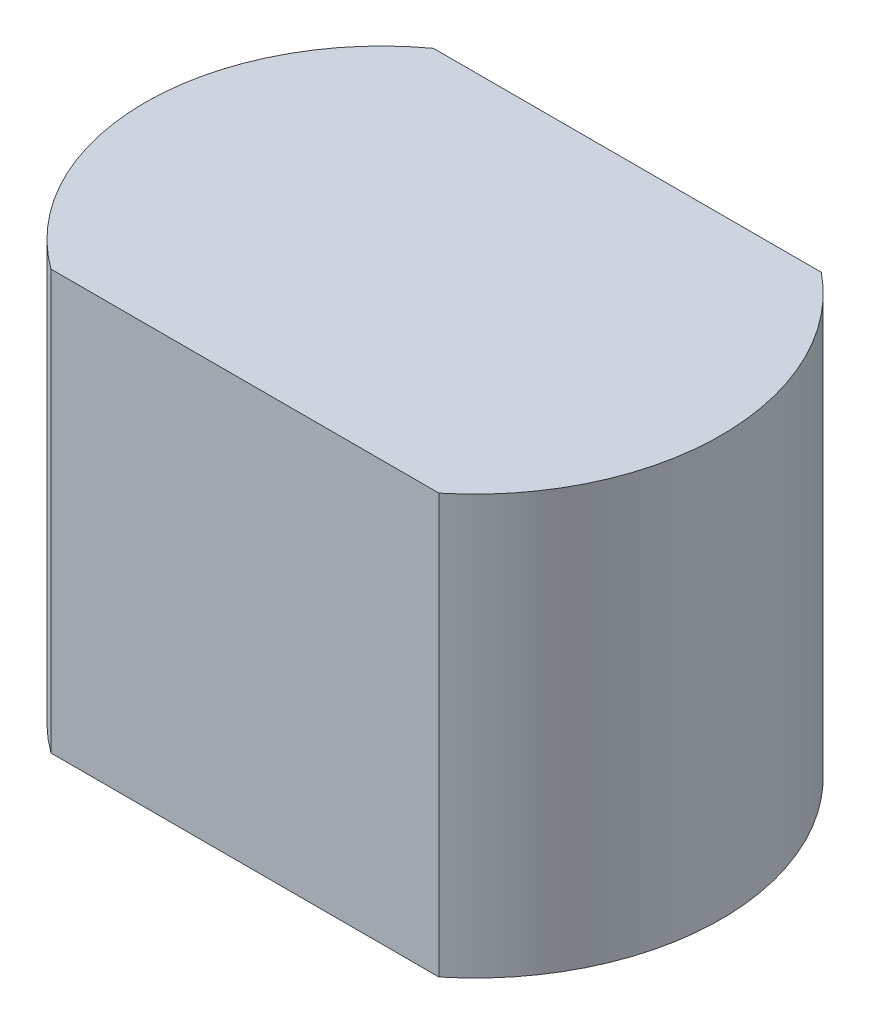
ISO-10303-21;
HEADER;
FILE_DESCRIPTION(('STEP AP214'),'2;1');
FILE_NAME('part.step','',(''),(''),'','','');
FILE_SCHEMA(('AUTOMOTIVE_DESIGN { 1 0 10303 214 1 1 1 1 }'));
ENDSEC;
DATA;
#1=APPLICATION_CONTEXT('core data for automotive mechanical design processes');
#2=APPLICATION_PROTOCOL_DEFINITION('international standard','automotive_design',2000,#1);
#3=PRODUCT_CONTEXT('',#1,'mechanical');
#4=PRODUCT('Part','Part','',(#3));
#5=PRODUCT_RELATED_PRODUCT_CATEGORY('part','',(#4));
#6=PRODUCT_DEFINITION_FORMATION('','',#4);
#7=PRODUCT_DEFINITION_CONTEXT('part definition',#1,'design');
#8=PRODUCT_DEFINITION('design','',#6,#7);
#9=PRODUCT_DEFINITION_SHAPE('','',#8);
#10=(LENGTH_UNIT() NAMED_UNIT(*) SI_UNIT(.MILLI.,.METRE.));
#11=(NAMED_UNIT(*) PLANE_ANGLE_UNIT() SI_UNIT($,.RADIAN.));
#12=(NAMED_UNIT(*) SI_UNIT($,.STERADIAN.) SOLID_ANGLE_UNIT());
#13=UNCERTAINTY_MEASURE_WITH_UNIT(LENGTH_MEASURE(1.E-05),#10,'distance_accuracy_value','');
#14=(GEOMETRIC_REPRESENTATION_CONTEXT(3) GLOBAL_UNCERTAINTY_ASSIGNED_CONTEXT((#13)) GLOBAL_UNIT_ASSIGNED_CONTEXT((#10,
#11,#12)) REPRESENTATION_CONTEXT('',''));
#15=CARTESIAN_POINT('',(0.,0.,0.));
#16=DIRECTION('',(0.,0.,1.));
#17=DIRECTION('',(1.,0.,0.));
#18=AXIS2_PLACEMENT_3D('',#15,#16,#17);
#19=CARTESIAN_POINT('',(-2.84057589804899,4.,-0.678750097591803));
#20=DIRECTION('',(0.,-1.,0.));
#21=DIRECTION('',(0.,0.,-1.));
#22=AXIS2_PLACEMENT_3D('',#19,#20,#21);
#23=CYLINDRICAL_SURFACE('',#22,2.25839401033057);
#24=CARTESIAN_POINT('',(-2.84057589804899,0.,-0.678750097591803));
#25=DIRECTION('',(0.,1.,0.));
#26=DIRECTION('',(0.,0.,1.));
#27=AXIS2_PLACEMENT_3D('',#24,#25,#26);
#28=CIRCLE('',#27,2.25839401033057);
#29=CARTESIAN_POINT('',(-4.17088357144525,0.,-2.5037500975918));
#30=VERTEX_POINT('',#29);
#31=CARTESIAN_POINT('',(-4.17088357144525,0.,1.1462499024082));
#32=VERTEX_POINT('',#31);
#33=EDGE_CURVE('E102',#30,#32,#28,.T.);
#34=ORIENTED_EDGE('',*,*,#33,.T.);
#35=DIRECTION('',(0.,-1.,0.));
#36=VECTOR('',#35,1.);
#37=CARTESIAN_POINT('',(-4.17088357144525,4.,1.1462499024082));
#38=LINE('',#37,#36);
#39=CARTESIAN_POINT('',(-4.17088357144525,4.,1.1462499024082));
#40=VERTEX_POINT('',#39);
#41=EDGE_CURVE('E11',#40,#32,#38,.T.);
#42=ORIENTED_EDGE('',*,*,#41,.F.);
#43=CARTESIAN_POINT('',(-2.84057589804899,4.,-0.678750097591803));
#44=DIRECTION('',(0.,1.,0.));
#45=DIRECTION('',(0.,0.,1.));
#46=AXIS2_PLACEMENT_3D('',#43,#44,#45);
#47=CIRCLE('',#46,2.25839401033057);
#48=CARTESIAN_POINT('',(-4.17088357144525,4.,-2.5037500975918));
#49=VERTEX_POINT('',#48);
#50=EDGE_CURVE('E90',#49,#40,#47,.T.);
#51=ORIENTED_EDGE('',*,*,#50,.F.);
#52=DIRECTION('',(0.,-1.,0.));
#53=VECTOR('',#52,1.);
#54=CARTESIAN_POINT('',(-4.17088357144525,4.,-2.5037500975918));
#55=LINE('',#54,#53);
#56=EDGE_CURVE('E98',#49,#30,#55,.T.);
#57=ORIENTED_EDGE('',*,*,#56,.T.);
#58=EDGE_LOOP('',(#34,#42,#51,#57));
#59=FACE_BOUND('',#58,.T.);
#60=ADVANCED_FACE('F39',(#59),#23,.T.);
#61=CARTESIAN_POINT('',(-0.468391856893293,4.,1.1462499024082));
#62=DIRECTION('',(0.,0.,-1.));
#63=DIRECTION('',(-1.,0.,0.));
#64=AXIS2_PLACEMENT_3D('',#61,#62,#63);
#65=PLANE('',#64);
#66=DIRECTION('',(1.,0.,0.));
#67=VECTOR('',#66,1.);
#68=CARTESIAN_POINT('',(-0.468391856893293,0.,1.1462499024082));
#69=LINE('',#68,#67);
#70=CARTESIAN_POINT('',(-0.468391856893293,0.,1.1462499024082));
#71=VERTEX_POINT('',#70);
#72=EDGE_CURVE('E94',#32,#71,#69,.T.);
#73=ORIENTED_EDGE('',*,*,#72,.T.);
#74=DIRECTION('',(0.,-1.,0.));
#75=VECTOR('',#74,1.);
#76=CARTESIAN_POINT('',(-0.468391856893293,4.,1.1462499024082));
#77=LINE('',#76,#75);
#78=CARTESIAN_POINT('',(-0.468391856893293,4.,1.1462499024082));
#79=VERTEX_POINT('',#78);
#80=EDGE_CURVE('E47',#79,#71,#77,.T.);
#81=ORIENTED_EDGE('',*,*,#80,.F.);
#82=DIRECTION('',(1.,0.,0.));
#83=VECTOR('',#82,1.);
#84=CARTESIAN_POINT('',(-0.468391856893293,4.,1.1462499024082));
#85=LINE('',#84,#83);
#86=EDGE_CURVE('E85',#40,#79,#85,.T.);
#87=ORIENTED_EDGE('',*,*,#86,.F.);
#88=ORIENTED_EDGE('',*,*,#41,.T.);
#89=EDGE_LOOP('',(#73,#81,#87,#88));
#90=FACE_BOUND('',#89,.T.);
#91=ADVANCED_FACE('F93',(#90),#65,.F.);
#92=CARTESIAN_POINT('',(-1.94910584153794,4.,-0.678750097591803));
#93=DIRECTION('',(0.,-1.,0.));
#94=DIRECTION('',(0.,0.,-1.));
#95=AXIS2_PLACEMENT_3D('',#92,#93,#94);
#96=CYLINDRICAL_SURFACE('',#95,2.35013593315838);
#97=CARTESIAN_POINT('',(-1.94910584153794,0.,-0.678750097591803));
#98=DIRECTION('',(0.,1.,0.));
#99=DIRECTION('',(0.,0.,-1.));
#100=AXIS2_PLACEMENT_3D('',#97,#98,#99);
#101=CIRCLE('',#100,2.35013593315838);
#102=CARTESIAN_POINT('',(-0.468391856893294,0.,-2.5037500975918));
#103=VERTEX_POINT('',#102);
#104=EDGE_CURVE('E72',#71,#103,#101,.T.);
#105=ORIENTED_EDGE('',*,*,#104,.T.);
#106=DIRECTION('',(0.,-1.,0.));
#107=VECTOR('',#106,1.);
#108=CARTESIAN_POINT('',(-0.468391856893294,4.,-2.5037500975918));
#109=LINE('',#108,#107);
#110=CARTESIAN_POINT('',(-0.468391856893294,4.,-2.5037500975918));
#111=VERTEX_POINT('',#110);
#112=EDGE_CURVE('E95',#111,#103,#109,.T.);
#113=ORIENTED_EDGE('',*,*,#112,.F.);
#114=CARTESIAN_POINT('',(-1.94910584153794,4.,-0.678750097591803));
#115=DIRECTION('',(0.,1.,0.));
#116=DIRECTION('',(0.,0.,-1.));
#117=AXIS2_PLACEMENT_3D('',#114,#115,#116);
#118=CIRCLE('',#117,2.35013593315838);
#119=EDGE_CURVE('E88',#79,#111,#118,.T.);
#120=ORIENTED_EDGE('',*,*,#119,.F.);
#121=ORIENTED_EDGE('',*,*,#80,.T.);
#122=EDGE_LOOP('',(#105,#113,#120,#121));
#123=FACE_BOUND('',#122,.T.);
#124=ADVANCED_FACE('F96',(#123),#96,.T.);
#125=CARTESIAN_POINT('',(-4.17088357144525,4.,-2.5037500975918));
#126=DIRECTION('',(0.,0.,1.));
#127=DIRECTION('',(1.,0.,0.));
#128=AXIS2_PLACEMENT_3D('',#125,#126,#127);
#129=PLANE('',#128);
#130=DIRECTION('',(-1.,0.,0.));
#131=VECTOR('',#130,1.);
#132=CARTESIAN_POINT('',(-4.17088357144525,0.,-2.5037500975918));
#133=LINE('',#132,#131);
#134=EDGE_CURVE('E78',#103,#30,#133,.T.);
#135=ORIENTED_EDGE('',*,*,#134,.T.);
#136=ORIENTED_EDGE('',*,*,#56,.F.);
#137=DIRECTION('',(-1.,0.,0.));
#138=VECTOR('',#137,1.);
#139=CARTESIAN_POINT('',(-4.17088357144525,4.,-2.5037500975918));
#140=LINE('',#139,#138);
#141=EDGE_CURVE('E55',#111,#49,#140,.T.);
#142=ORIENTED_EDGE('',*,*,#141,.F.);
#143=ORIENTED_EDGE('',*,*,#112,.T.);
#144=EDGE_LOOP('',(#135,#136,#142,#143));
#145=FACE_BOUND('',#144,.T.);
#146=ADVANCED_FACE('F109',(#145),#129,.F.);
#147=CARTESIAN_POINT('',(-2.84057589804899,4.,-0.678750097591803));
#148=DIRECTION('',(0.,1.,0.));
#149=DIRECTION('',(0.,0.,1.));
#150=AXIS2_PLACEMENT_3D('',#147,#148,#149);
#151=PLANE('',#150);
#152=ORIENTED_EDGE('',*,*,#50,.T.);
#153=ORIENTED_EDGE('',*,*,#86,.T.);
#154=ORIENTED_EDGE('',*,*,#119,.T.);
#155=ORIENTED_EDGE('',*,*,#141,.T.);
#156=EDGE_LOOP('',(#152,#153,#154,#155));
#157=FACE_BOUND('',#156,.T.);
#158=ADVANCED_FACE('F86',(#157),#151,.T.);
#159=CARTESIAN_POINT('',(-2.84057589804899,0.,-0.678750097591803));
#160=DIRECTION('',(0.,1.,0.));
#161=DIRECTION('',(0.,0.,1.));
#162=AXIS2_PLACEMENT_3D('',#159,#160,#161);
#163=PLANE('',#162);
#164=ORIENTED_EDGE('',*,*,#33,.F.);
#165=ORIENTED_EDGE('',*,*,#134,.F.);
#166=ORIENTED_EDGE('',*,*,#104,.F.);
#167=ORIENTED_EDGE('',*,*,#72,.F.);
#168=EDGE_LOOP('',(#164,#165,#166,#167));
#169=FACE_BOUND('',#168,.T.);
#170=ADVANCED_FACE('F112',(#169),#163,.F.);
#171=CLOSED_SHELL('',(#60,#91,#124,#146,#158,#170));
#172=MANIFOLD_SOLID_BREP('B2',#171);
#173=ADVANCED_BREP_SHAPE_REPRESENTATION('',(#18,#172),#14);
#174=SHAPE_DEFINITION_REPRESENTATION(#9,#173);
ENDSEC;
END-ISO-10303-21;
